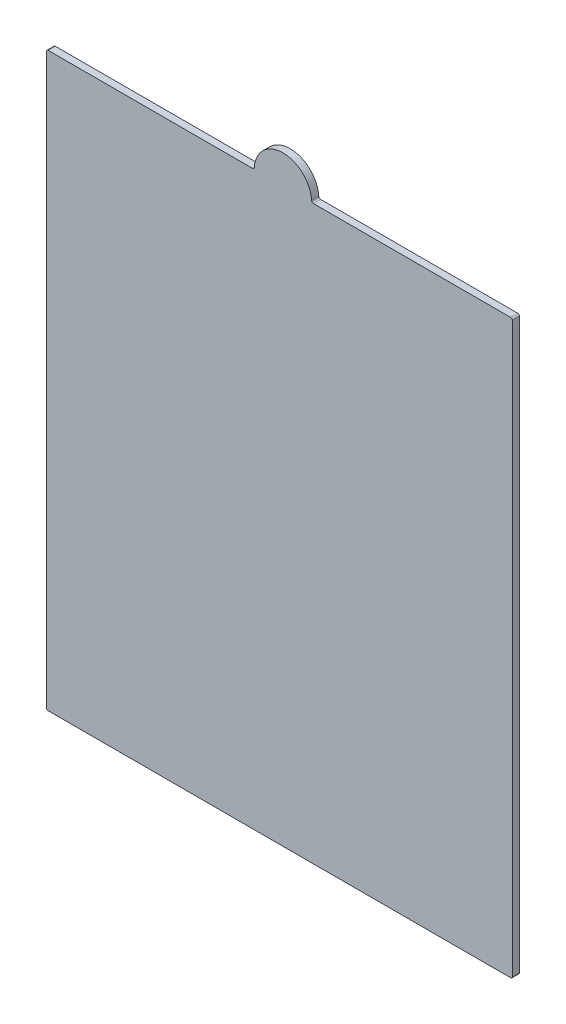
ISO-10303-21;
HEADER;
FILE_DESCRIPTION(('STEP AP214'),'2;1');
FILE_NAME('part.step','',(''),(''),'','','');
FILE_SCHEMA(('AUTOMOTIVE_DESIGN { 1 0 10303 214 1 1 1 1 }'));
ENDSEC;
DATA;
#1=APPLICATION_CONTEXT('core data for automotive mechanical design processes');
#2=APPLICATION_PROTOCOL_DEFINITION('international standard','automotive_design',2000,#1);
#3=PRODUCT_CONTEXT('',#1,'mechanical');
#4=PRODUCT('Part','Part','',(#3));
#5=PRODUCT_RELATED_PRODUCT_CATEGORY('part','',(#4));
#6=PRODUCT_DEFINITION_FORMATION('','',#4);
#7=PRODUCT_DEFINITION_CONTEXT('part definition',#1,'design');
#8=PRODUCT_DEFINITION('design','',#6,#7);
#9=PRODUCT_DEFINITION_SHAPE('','',#8);
#10=(LENGTH_UNIT() NAMED_UNIT(*) SI_UNIT(.MILLI.,.METRE.));
#11=(NAMED_UNIT(*) PLANE_ANGLE_UNIT() SI_UNIT($,.RADIAN.));
#12=(NAMED_UNIT(*) SI_UNIT($,.STERADIAN.) SOLID_ANGLE_UNIT());
#13=UNCERTAINTY_MEASURE_WITH_UNIT(LENGTH_MEASURE(1.E-05),#10,'distance_accuracy_value','');
#14=(GEOMETRIC_REPRESENTATION_CONTEXT(3) GLOBAL_UNCERTAINTY_ASSIGNED_CONTEXT((#13)) GLOBAL_UNIT_ASSIGNED_CONTEXT((#10,
#11,#12)) REPRESENTATION_CONTEXT('',''));
#15=CARTESIAN_POINT('',(0.,0.,0.));
#16=DIRECTION('',(0.,0.,1.));
#17=DIRECTION('',(1.,0.,0.));
#18=AXIS2_PLACEMENT_3D('',#15,#16,#17);
#19=CARTESIAN_POINT('',(0.,253.103,3.175));
#20=DIRECTION('',(0.,-1.,0.));
#21=DIRECTION('',(0.,0.,-1.));
#22=AXIS2_PLACEMENT_3D('',#19,#20,#21);
#23=PLANE('',#22);
#24=DIRECTION('',(-1.,0.,0.));
#25=VECTOR('',#24,1.);
#26=CARTESIAN_POINT('',(0.,253.103,0.));
#27=LINE('',#26,#25);
#28=CARTESIAN_POINT('',(91.2335470790385,253.103,0.));
#29=VERTEX_POINT('',#28);
#30=CARTESIAN_POINT('',(0.79375,253.103,0.));
#31=VERTEX_POINT('',#30);
#32=EDGE_CURVE('E158',#29,#31,#27,.T.);
#33=ORIENTED_EDGE('',*,*,#32,.T.);
#34=DIRECTION('',(0.,0.,-1.));
#35=VECTOR('',#34,1.);
#36=CARTESIAN_POINT('',(0.79375,253.103,3.175));
#37=LINE('',#36,#35);
#38=CARTESIAN_POINT('',(0.79375,253.103,3.175));
#39=VERTEX_POINT('',#38);
#40=EDGE_CURVE('E53',#31,#39,#37,.F.);
#41=ORIENTED_EDGE('',*,*,#40,.T.);
#42=DIRECTION('',(-1.,0.,0.));
#43=VECTOR('',#42,1.);
#44=CARTESIAN_POINT('',(0.,253.103,3.175));
#45=LINE('',#44,#43);
#46=CARTESIAN_POINT('',(91.2335470790385,253.103,3.175));
#47=VERTEX_POINT('',#46);
#48=EDGE_CURVE('E232',#47,#39,#45,.T.);
#49=ORIENTED_EDGE('',*,*,#48,.F.);
#50=DIRECTION('',(0.,0.,1.));
#51=VECTOR('',#50,1.);
#52=CARTESIAN_POINT('',(91.2335470790385,253.103,0.));
#53=LINE('',#52,#51);
#54=EDGE_CURVE('E195',#47,#29,#53,.F.);
#55=ORIENTED_EDGE('',*,*,#54,.T.);
#56=EDGE_LOOP('',(#33,#41,#49,#55));
#57=FACE_BOUND('',#56,.T.);
#58=ADVANCED_FACE('F38',(#57),#23,.F.);
#59=CARTESIAN_POINT('',(205.45925,253.103,3.175));
#60=VERTEX_POINT('',#59);
#61=CARTESIAN_POINT('',(118.174315442246,253.103,3.175));
#62=VERTEX_POINT('',#61);
#63=EDGE_CURVE('E168',#60,#62,#45,.T.);
#64=ORIENTED_EDGE('',*,*,#63,.F.);
#65=DIRECTION('',(0.,0.,-1.));
#66=VECTOR('',#65,1.);
#67=CARTESIAN_POINT('',(205.45925,253.103,3.175));
#68=LINE('',#67,#66);
#69=CARTESIAN_POINT('',(205.45925,253.103,0.));
#70=VERTEX_POINT('',#69);
#71=EDGE_CURVE('E192',#60,#70,#68,.T.);
#72=ORIENTED_EDGE('',*,*,#71,.T.);
#73=CARTESIAN_POINT('',(118.174315442246,253.103,0.));
#74=VERTEX_POINT('',#73);
#75=EDGE_CURVE('E164',#70,#74,#27,.T.);
#76=ORIENTED_EDGE('',*,*,#75,.T.);
#77=DIRECTION('',(0.,0.,1.));
#78=VECTOR('',#77,1.);
#79=CARTESIAN_POINT('',(118.174315442246,253.103,3.175));
#80=LINE('',#79,#78);
#81=EDGE_CURVE('E190',#74,#62,#80,.T.);
#82=ORIENTED_EDGE('',*,*,#81,.T.);
#83=EDGE_LOOP('',(#64,#72,#76,#82));
#84=FACE_BOUND('',#83,.T.);
#85=ADVANCED_FACE('F215',(#84),#23,.F.);
#86=CARTESIAN_POINT('',(0.,0.,3.175));
#87=DIRECTION('',(1.,0.,0.));
#88=DIRECTION('',(0.,0.,-1.));
#89=AXIS2_PLACEMENT_3D('',#86,#87,#88);
#90=PLANE('',#89);
#91=DIRECTION('',(0.,-1.,0.));
#92=VECTOR('',#91,1.);
#93=CARTESIAN_POINT('',(0.,0.,0.));
#94=LINE('',#93,#92);
#95=CARTESIAN_POINT('',(0.,252.30925,0.));
#96=VERTEX_POINT('',#95);
#97=CARTESIAN_POINT('',(0.,0.79375,0.));
#98=VERTEX_POINT('',#97);
#99=EDGE_CURVE('E155',#96,#98,#94,.T.);
#100=ORIENTED_EDGE('',*,*,#99,.T.);
#101=DIRECTION('',(0.,0.,-1.));
#102=VECTOR('',#101,1.);
#103=CARTESIAN_POINT('',(0.,0.79375,3.175));
#104=LINE('',#103,#102);
#105=CARTESIAN_POINT('',(0.,0.79375,3.175));
#106=VERTEX_POINT('',#105);
#107=EDGE_CURVE('E133',#98,#106,#104,.F.);
#108=ORIENTED_EDGE('',*,*,#107,.T.);
#109=DIRECTION('',(0.,-1.,0.));
#110=VECTOR('',#109,1.);
#111=CARTESIAN_POINT('',(0.,0.,3.175));
#112=LINE('',#111,#110);
#113=CARTESIAN_POINT('',(0.,252.30925,3.175));
#114=VERTEX_POINT('',#113);
#115=EDGE_CURVE('E167',#114,#106,#112,.T.);
#116=ORIENTED_EDGE('',*,*,#115,.F.);
#117=DIRECTION('',(0.,0.,-1.));
#118=VECTOR('',#117,1.);
#119=CARTESIAN_POINT('',(0.,252.30925,3.175));
#120=LINE('',#119,#118);
#121=EDGE_CURVE('E138',#114,#96,#120,.T.);
#122=ORIENTED_EDGE('',*,*,#121,.T.);
#123=EDGE_LOOP('',(#100,#108,#116,#122));
#124=FACE_BOUND('',#123,.T.);
#125=ADVANCED_FACE('F240',(#124),#90,.F.);
#126=CARTESIAN_POINT('',(0.,0.,3.175));
#127=DIRECTION('',(0.,1.,0.));
#128=DIRECTION('',(0.,0.,1.));
#129=AXIS2_PLACEMENT_3D('',#126,#127,#128);
#130=PLANE('',#129);
#131=DIRECTION('',(1.,0.,0.));
#132=VECTOR('',#131,1.);
#133=CARTESIAN_POINT('',(0.,0.,3.175));
#134=LINE('',#133,#132);
#135=CARTESIAN_POINT('',(0.79375,0.,3.175));
#136=VERTEX_POINT('',#135);
#137=CARTESIAN_POINT('',(205.45925,0.,3.175));
#138=VERTEX_POINT('',#137);
#139=EDGE_CURVE('E148',#136,#138,#134,.T.);
#140=ORIENTED_EDGE('',*,*,#139,.F.);
#141=DIRECTION('',(0.,0.,-1.));
#142=VECTOR('',#141,1.);
#143=CARTESIAN_POINT('',(0.79375,0.,3.175));
#144=LINE('',#143,#142);
#145=CARTESIAN_POINT('',(0.79375,0.,0.));
#146=VERTEX_POINT('',#145);
#147=EDGE_CURVE('E132',#136,#146,#144,.T.);
#148=ORIENTED_EDGE('',*,*,#147,.T.);
#149=DIRECTION('',(1.,0.,0.));
#150=VECTOR('',#149,1.);
#151=CARTESIAN_POINT('',(0.,0.,0.));
#152=LINE('',#151,#150);
#153=CARTESIAN_POINT('',(205.45925,0.,0.));
#154=VERTEX_POINT('',#153);
#155=EDGE_CURVE('E145',#146,#154,#152,.T.);
#156=ORIENTED_EDGE('',*,*,#155,.T.);
#157=DIRECTION('',(0.,0.,-1.));
#158=VECTOR('',#157,1.);
#159=CARTESIAN_POINT('',(205.45925,0.,3.175));
#160=LINE('',#159,#158);
#161=EDGE_CURVE('E150',#154,#138,#160,.F.);
#162=ORIENTED_EDGE('',*,*,#161,.T.);
#163=EDGE_LOOP('',(#140,#148,#156,#162));
#164=FACE_BOUND('',#163,.T.);
#165=ADVANCED_FACE('F144',(#164),#130,.F.);
#166=CARTESIAN_POINT('',(206.253,0.,3.175));
#167=DIRECTION('',(-1.,0.,0.));
#168=DIRECTION('',(0.,0.,1.));
#169=AXIS2_PLACEMENT_3D('',#166,#167,#168);
#170=PLANE('',#169);
#171=DIRECTION('',(0.,1.,0.));
#172=VECTOR('',#171,1.);
#173=CARTESIAN_POINT('',(206.253,0.,3.175));
#174=LINE('',#173,#172);
#175=CARTESIAN_POINT('',(206.253,0.79375,3.175));
#176=VERTEX_POINT('',#175);
#177=CARTESIAN_POINT('',(206.253,252.30925,3.175));
#178=VERTEX_POINT('',#177);
#179=EDGE_CURVE('E230',#176,#178,#174,.T.);
#180=ORIENTED_EDGE('',*,*,#179,.F.);
#181=DIRECTION('',(0.,0.,-1.));
#182=VECTOR('',#181,1.);
#183=CARTESIAN_POINT('',(206.253,0.79375,3.175));
#184=LINE('',#183,#182);
#185=CARTESIAN_POINT('',(206.253,0.79375,0.));
#186=VERTEX_POINT('',#185);
#187=EDGE_CURVE('E187',#176,#186,#184,.T.);
#188=ORIENTED_EDGE('',*,*,#187,.T.);
#189=DIRECTION('',(0.,1.,0.));
#190=VECTOR('',#189,1.);
#191=CARTESIAN_POINT('',(206.253,0.,0.));
#192=LINE('',#191,#190);
#193=CARTESIAN_POINT('',(206.253,252.30925,0.));
#194=VERTEX_POINT('',#193);
#195=EDGE_CURVE('E154',#186,#194,#192,.T.);
#196=ORIENTED_EDGE('',*,*,#195,.T.);
#197=DIRECTION('',(0.,0.,-1.));
#198=VECTOR('',#197,1.);
#199=CARTESIAN_POINT('',(206.253,252.30925,3.175));
#200=LINE('',#199,#198);
#201=EDGE_CURVE('E185',#194,#178,#200,.F.);
#202=ORIENTED_EDGE('',*,*,#201,.T.);
#203=EDGE_LOOP('',(#180,#188,#196,#202));
#204=FACE_BOUND('',#203,.T.);
#205=ADVANCED_FACE('F259',(#204),#170,.F.);
#206=CARTESIAN_POINT('',(0.,0.,3.175));
#207=DIRECTION('',(0.,0.,-1.));
#208=DIRECTION('',(-1.,0.,0.));
#209=AXIS2_PLACEMENT_3D('',#206,#207,#208);
#210=PLANE('',#209);
#211=ORIENTED_EDGE('',*,*,#115,.T.);
#212=CARTESIAN_POINT('',(0.79375,0.79375,3.175));
#213=DIRECTION('',(0.,0.,-1.));
#214=DIRECTION('',(-1.,0.,0.));
#215=AXIS2_PLACEMENT_3D('',#212,#213,#214);
#216=CIRCLE('',#215,0.79375);
#217=EDGE_CURVE('E183',#106,#136,#216,.F.);
#218=ORIENTED_EDGE('',*,*,#217,.T.);
#219=ORIENTED_EDGE('',*,*,#139,.T.);
#220=CARTESIAN_POINT('',(205.45925,0.79375,3.175));
#221=DIRECTION('',(0.,0.,-1.));
#222=DIRECTION('',(-1.,0.,0.));
#223=AXIS2_PLACEMENT_3D('',#220,#221,#222);
#224=CIRCLE('',#223,0.79375);
#225=EDGE_CURVE('E181',#138,#176,#224,.F.);
#226=ORIENTED_EDGE('',*,*,#225,.T.);
#227=ORIENTED_EDGE('',*,*,#179,.T.);
#228=CARTESIAN_POINT('',(205.45925,252.30925,3.175));
#229=DIRECTION('',(0.,0.,-1.));
#230=DIRECTION('',(-1.,0.,0.));
#231=AXIS2_PLACEMENT_3D('',#228,#229,#230);
#232=CIRCLE('',#231,0.79375);
#233=EDGE_CURVE('E179',#178,#60,#232,.F.);
#234=ORIENTED_EDGE('',*,*,#233,.T.);
#235=ORIENTED_EDGE('',*,*,#63,.T.);
#236=CARTESIAN_POINT('',(118.174315442246,253.89675,3.175));
#237=DIRECTION('',(0.,0.,-1.));
#238=DIRECTION('',(-1.,0.,0.));
#239=AXIS2_PLACEMENT_3D('',#236,#237,#238);
#240=CIRCLE('',#239,0.79375);
#241=CARTESIAN_POINT('',(117.381939902152,253.850058823529,3.175));
#242=VERTEX_POINT('',#241);
#243=EDGE_CURVE('E11',#62,#242,#240,.T.);
#244=ORIENTED_EDGE('',*,*,#243,.T.);
#245=CARTESIAN_POINT('',(104.703931260642,253.103,3.175));
#246=DIRECTION('',(0.,0.,1.));
#247=DIRECTION('',(1.,0.,0.));
#248=AXIS2_PLACEMENT_3D('',#245,#246,#247);
#249=CIRCLE('',#248,12.7);
#250=CARTESIAN_POINT('',(92.0259226191328,253.850058823529,3.175));
#251=VERTEX_POINT('',#250);
#252=EDGE_CURVE('E160',#242,#251,#249,.T.);
#253=ORIENTED_EDGE('',*,*,#252,.T.);
#254=CARTESIAN_POINT('',(91.2335470790385,253.89675,3.175));
#255=DIRECTION('',(0.,0.,-1.));
#256=DIRECTION('',(-1.,0.,0.));
#257=AXIS2_PLACEMENT_3D('',#254,#255,#256);
#258=CIRCLE('',#257,0.79375);
#259=EDGE_CURVE('E60',#251,#47,#258,.T.);
#260=ORIENTED_EDGE('',*,*,#259,.T.);
#261=ORIENTED_EDGE('',*,*,#48,.T.);
#262=CARTESIAN_POINT('',(0.79375,252.30925,3.175));
#263=DIRECTION('',(0.,0.,-1.));
#264=DIRECTION('',(-1.,0.,0.));
#265=AXIS2_PLACEMENT_3D('',#262,#263,#264);
#266=CIRCLE('',#265,0.79375);
#267=EDGE_CURVE('E177',#39,#114,#266,.F.);
#268=ORIENTED_EDGE('',*,*,#267,.T.);
#269=EDGE_LOOP('',(#211,#218,#219,#226,#227,#234,#235,#244,#253,#260,#261,#268));
#270=FACE_BOUND('',#269,.T.);
#271=ADVANCED_FACE('F221',(#270),#210,.F.);
#272=CARTESIAN_POINT('',(0.,0.,0.));
#273=DIRECTION('',(0.,0.,-1.));
#274=DIRECTION('',(-1.,0.,0.));
#275=AXIS2_PLACEMENT_3D('',#272,#273,#274);
#276=PLANE('',#275);
#277=ORIENTED_EDGE('',*,*,#155,.F.);
#278=CARTESIAN_POINT('',(0.79375,0.79375,0.));
#279=DIRECTION('',(0.,0.,-1.));
#280=DIRECTION('',(-1.,0.,0.));
#281=AXIS2_PLACEMENT_3D('',#278,#279,#280);
#282=CIRCLE('',#281,0.79375);
#283=EDGE_CURVE('E128',#146,#98,#282,.T.);
#284=ORIENTED_EDGE('',*,*,#283,.T.);
#285=ORIENTED_EDGE('',*,*,#99,.F.);
#286=CARTESIAN_POINT('',(0.79375,252.30925,0.));
#287=DIRECTION('',(0.,0.,-1.));
#288=DIRECTION('',(-1.,0.,0.));
#289=AXIS2_PLACEMENT_3D('',#286,#287,#288);
#290=CIRCLE('',#289,0.79375);
#291=EDGE_CURVE('E149',#96,#31,#290,.T.);
#292=ORIENTED_EDGE('',*,*,#291,.T.);
#293=ORIENTED_EDGE('',*,*,#32,.F.);
#294=CARTESIAN_POINT('',(91.2335470790385,253.89675,0.));
#295=DIRECTION('',(0.,0.,-1.));
#296=DIRECTION('',(-1.,0.,0.));
#297=AXIS2_PLACEMENT_3D('',#294,#295,#296);
#298=CIRCLE('',#297,0.79375);
#299=CARTESIAN_POINT('',(92.0259226191328,253.850058823529,0.));
#300=VERTEX_POINT('',#299);
#301=EDGE_CURVE('E204',#29,#300,#298,.F.);
#302=ORIENTED_EDGE('',*,*,#301,.T.);
#303=CARTESIAN_POINT('',(104.703931260642,253.103,0.));
#304=DIRECTION('',(0.,0.,1.));
#305=DIRECTION('',(1.,0.,0.));
#306=AXIS2_PLACEMENT_3D('',#303,#304,#305);
#307=CIRCLE('',#306,12.7);
#308=CARTESIAN_POINT('',(117.381939902152,253.850058823529,0.));
#309=VERTEX_POINT('',#308);
#310=EDGE_CURVE('E209',#309,#300,#307,.T.);
#311=ORIENTED_EDGE('',*,*,#310,.F.);
#312=CARTESIAN_POINT('',(118.174315442246,253.89675,0.));
#313=DIRECTION('',(0.,0.,-1.));
#314=DIRECTION('',(-1.,0.,0.));
#315=AXIS2_PLACEMENT_3D('',#312,#313,#314);
#316=CIRCLE('',#315,0.79375);
#317=EDGE_CURVE('E46',#309,#74,#316,.F.);
#318=ORIENTED_EDGE('',*,*,#317,.T.);
#319=ORIENTED_EDGE('',*,*,#75,.F.);
#320=CARTESIAN_POINT('',(205.45925,252.30925,0.));
#321=DIRECTION('',(0.,0.,-1.));
#322=DIRECTION('',(-1.,0.,0.));
#323=AXIS2_PLACEMENT_3D('',#320,#321,#322);
#324=CIRCLE('',#323,0.79375);
#325=EDGE_CURVE('E171',#70,#194,#324,.T.);
#326=ORIENTED_EDGE('',*,*,#325,.T.);
#327=ORIENTED_EDGE('',*,*,#195,.F.);
#328=CARTESIAN_POINT('',(205.45925,0.79375,0.));
#329=DIRECTION('',(0.,0.,-1.));
#330=DIRECTION('',(-1.,0.,0.));
#331=AXIS2_PLACEMENT_3D('',#328,#329,#330);
#332=CIRCLE('',#331,0.79375);
#333=EDGE_CURVE('E139',#186,#154,#332,.T.);
#334=ORIENTED_EDGE('',*,*,#333,.T.);
#335=EDGE_LOOP('',(#277,#284,#285,#292,#293,#302,#311,#318,#319,#326,#327,#334));
#336=FACE_BOUND('',#335,.T.);
#337=ADVANCED_FACE('F152',(#336),#276,.T.);
#338=CARTESIAN_POINT('',(104.703931260642,253.103,3.175));
#339=DIRECTION('',(0.,0.,-1.));
#340=DIRECTION('',(-1.,0.,0.));
#341=AXIS2_PLACEMENT_3D('',#338,#339,#340);
#342=CYLINDRICAL_SURFACE('',#341,12.7);
#343=ORIENTED_EDGE('',*,*,#310,.T.);
#344=DIRECTION('',(0.,0.,-1.));
#345=VECTOR('',#344,1.);
#346=CARTESIAN_POINT('',(92.0259226191328,253.850058823529,3.175));
#347=LINE('',#346,#345);
#348=EDGE_CURVE('E202',#300,#251,#347,.F.);
#349=ORIENTED_EDGE('',*,*,#348,.T.);
#350=ORIENTED_EDGE('',*,*,#252,.F.);
#351=DIRECTION('',(0.,0.,-1.));
#352=VECTOR('',#351,1.);
#353=CARTESIAN_POINT('',(117.381939902152,253.850058823529,3.175));
#354=LINE('',#353,#352);
#355=EDGE_CURVE('E199',#242,#309,#354,.T.);
#356=ORIENTED_EDGE('',*,*,#355,.T.);
#357=EDGE_LOOP('',(#343,#349,#350,#356));
#358=FACE_BOUND('',#357,.T.);
#359=ADVANCED_FACE('F223',(#358),#342,.T.);
#360=CARTESIAN_POINT('',(0.79375,0.79375,3.175));
#361=DIRECTION('',(0.,0.,-1.));
#362=DIRECTION('',(-1.,0.,0.));
#363=AXIS2_PLACEMENT_3D('',#360,#361,#362);
#364=CYLINDRICAL_SURFACE('',#363,0.79375);
#365=ORIENTED_EDGE('',*,*,#217,.F.);
#366=ORIENTED_EDGE('',*,*,#107,.F.);
#367=ORIENTED_EDGE('',*,*,#283,.F.);
#368=ORIENTED_EDGE('',*,*,#147,.F.);
#369=EDGE_LOOP('',(#365,#366,#367,#368));
#370=FACE_BOUND('',#369,.T.);
#371=ADVANCED_FACE('F131',(#370),#364,.T.);
#372=CARTESIAN_POINT('',(205.45925,0.79375,3.175));
#373=DIRECTION('',(0.,0.,-1.));
#374=DIRECTION('',(-1.,0.,0.));
#375=AXIS2_PLACEMENT_3D('',#372,#373,#374);
#376=CYLINDRICAL_SURFACE('',#375,0.79375);
#377=ORIENTED_EDGE('',*,*,#225,.F.);
#378=ORIENTED_EDGE('',*,*,#161,.F.);
#379=ORIENTED_EDGE('',*,*,#333,.F.);
#380=ORIENTED_EDGE('',*,*,#187,.F.);
#381=EDGE_LOOP('',(#377,#378,#379,#380));
#382=FACE_BOUND('',#381,.T.);
#383=ADVANCED_FACE('F269',(#382),#376,.T.);
#384=CARTESIAN_POINT('',(205.45925,252.30925,3.175));
#385=DIRECTION('',(0.,0.,-1.));
#386=DIRECTION('',(-1.,0.,0.));
#387=AXIS2_PLACEMENT_3D('',#384,#385,#386);
#388=CYLINDRICAL_SURFACE('',#387,0.79375);
#389=ORIENTED_EDGE('',*,*,#233,.F.);
#390=ORIENTED_EDGE('',*,*,#201,.F.);
#391=ORIENTED_EDGE('',*,*,#325,.F.);
#392=ORIENTED_EDGE('',*,*,#71,.F.);
#393=EDGE_LOOP('',(#389,#390,#391,#392));
#394=FACE_BOUND('',#393,.T.);
#395=ADVANCED_FACE('F249',(#394),#388,.T.);
#396=CARTESIAN_POINT('',(0.79375,252.30925,3.175));
#397=DIRECTION('',(0.,0.,-1.));
#398=DIRECTION('',(-1.,0.,0.));
#399=AXIS2_PLACEMENT_3D('',#396,#397,#398);
#400=CYLINDRICAL_SURFACE('',#399,0.79375);
#401=ORIENTED_EDGE('',*,*,#267,.F.);
#402=ORIENTED_EDGE('',*,*,#40,.F.);
#403=ORIENTED_EDGE('',*,*,#291,.F.);
#404=ORIENTED_EDGE('',*,*,#121,.F.);
#405=EDGE_LOOP('',(#401,#402,#403,#404));
#406=FACE_BOUND('',#405,.T.);
#407=ADVANCED_FACE('F238',(#406),#400,.T.);
#408=CARTESIAN_POINT('',(91.2335470790385,253.89675,3.175));
#409=DIRECTION('',(0.,0.,-1.));
#410=DIRECTION('',(-1.,0.,0.));
#411=AXIS2_PLACEMENT_3D('',#408,#409,#410);
#412=CYLINDRICAL_SURFACE('',#411,0.79375);
#413=ORIENTED_EDGE('',*,*,#259,.F.);
#414=ORIENTED_EDGE('',*,*,#348,.F.);
#415=ORIENTED_EDGE('',*,*,#301,.F.);
#416=ORIENTED_EDGE('',*,*,#54,.F.);
#417=EDGE_LOOP('',(#413,#414,#415,#416));
#418=FACE_BOUND('',#417,.T.);
#419=ADVANCED_FACE('F243',(#418),#412,.F.);
#420=CARTESIAN_POINT('',(118.174315442246,253.89675,3.175));
#421=DIRECTION('',(0.,0.,-1.));
#422=DIRECTION('',(-1.,0.,0.));
#423=AXIS2_PLACEMENT_3D('',#420,#421,#422);
#424=CYLINDRICAL_SURFACE('',#423,0.79375);
#425=ORIENTED_EDGE('',*,*,#243,.F.);
#426=ORIENTED_EDGE('',*,*,#81,.F.);
#427=ORIENTED_EDGE('',*,*,#317,.F.);
#428=ORIENTED_EDGE('',*,*,#355,.F.);
#429=EDGE_LOOP('',(#425,#426,#427,#428));
#430=FACE_BOUND('',#429,.T.);
#431=ADVANCED_FACE('F40',(#430),#424,.F.);
#432=CLOSED_SHELL('',(#58,#85,#125,#165,#205,#271,#337,#359,#371,#383,#395,#407,#419,#431));
#433=MANIFOLD_SOLID_BREP('B2',#432);
#434=ADVANCED_BREP_SHAPE_REPRESENTATION('',(#18,#433),#14);
#435=SHAPE_DEFINITION_REPRESENTATION(#9,#434);
ENDSEC;
END-ISO-10303-21;
